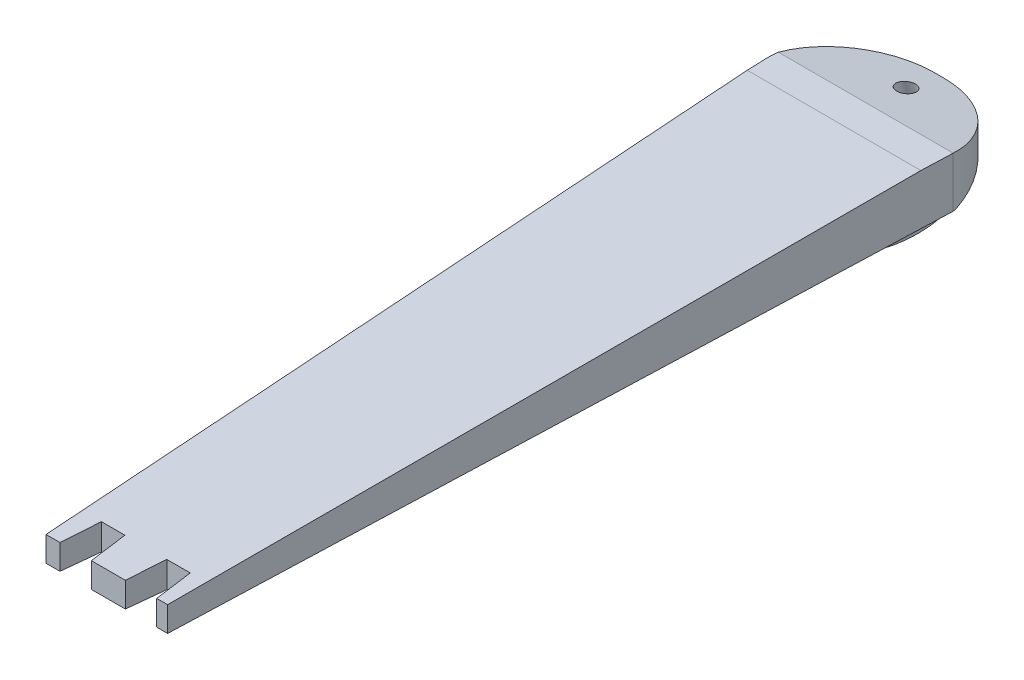
ISO-10303-21;
HEADER;
FILE_DESCRIPTION(('STEP AP214'),'2;1');
FILE_NAME('part.step','',(''),(''),'','','');
FILE_SCHEMA(('AUTOMOTIVE_DESIGN { 1 0 10303 214 1 1 1 1 }'));
ENDSEC;
DATA;
#1=APPLICATION_CONTEXT('core data for automotive mechanical design processes');
#2=APPLICATION_PROTOCOL_DEFINITION('international standard','automotive_design',2000,#1);
#3=PRODUCT_CONTEXT('',#1,'mechanical');
#4=PRODUCT('Part','Part','',(#3));
#5=PRODUCT_RELATED_PRODUCT_CATEGORY('part','',(#4));
#6=PRODUCT_DEFINITION_FORMATION('','',#4);
#7=PRODUCT_DEFINITION_CONTEXT('part definition',#1,'design');
#8=PRODUCT_DEFINITION('design','',#6,#7);
#9=PRODUCT_DEFINITION_SHAPE('','',#8);
#10=(LENGTH_UNIT() NAMED_UNIT(*) SI_UNIT(.MILLI.,.METRE.));
#11=(NAMED_UNIT(*) PLANE_ANGLE_UNIT() SI_UNIT($,.RADIAN.));
#12=(NAMED_UNIT(*) SI_UNIT($,.STERADIAN.) SOLID_ANGLE_UNIT());
#13=UNCERTAINTY_MEASURE_WITH_UNIT(LENGTH_MEASURE(1.E-05),#10,'distance_accuracy_value','');
#14=(GEOMETRIC_REPRESENTATION_CONTEXT(3) GLOBAL_UNCERTAINTY_ASSIGNED_CONTEXT((#13)) GLOBAL_UNIT_ASSIGNED_CONTEXT((#10,
#11,#12)) REPRESENTATION_CONTEXT('',''));
#15=CARTESIAN_POINT('',(0.,0.,0.));
#16=DIRECTION('',(0.,0.,1.));
#17=DIRECTION('',(1.,0.,0.));
#18=AXIS2_PLACEMENT_3D('',#15,#16,#17);
#19=CARTESIAN_POINT('',(-0.862818072965401,-4.,-19.126249045664));
#20=DIRECTION('',(0.,1.,0.));
#21=DIRECTION('',(0.,0.,1.));
#22=AXIS2_PLACEMENT_3D('',#19,#20,#21);
#23=CYLINDRICAL_SURFACE('',#22,10.);
#24=CARTESIAN_POINT('',(-0.862818072965401,-0.3627160121367,-19.126249045664));
#25=DIRECTION('',(0.,0.974370064785237,0.224951054343859));
#26=DIRECTION('',(0.,0.224951054343859,-0.974370064785237));
#27=AXIS2_PLACEMENT_3D('',#24,#25,#26);
#28=ELLIPSE('',#27,10.2630410779339,10.);
#29=CARTESIAN_POINT('',(-10.7386298593639,0.,-20.6973447014507));
#30=VERTEX_POINT('',#29);
#31=CARTESIAN_POINT('',(-7.94550184990103,-1.99251447764532,-12.0668163123678));
#32=VERTEX_POINT('',#31);
#33=EDGE_CURVE('E61',#30,#32,#28,.T.);
#34=ORIENTED_EDGE('',*,*,#33,.T.);
#35=CARTESIAN_POINT('',(-0.862818072965401,-1.98643727673337,-19.126249045664));
#36=DIRECTION('',(0.,0.999999629458084,0.000860862181097529));
#37=DIRECTION('',(0.,0.000860862181097529,-0.999999629458084));
#38=AXIS2_PLACEMENT_3D('',#35,#36,#37);
#39=ELLIPSE('',#38,10.0000037054205,10.);
#40=CARTESIAN_POINT('',(-7.93388588483091,-1.99252449384815,-12.0551812337985));
#41=VERTEX_POINT('',#40);
#42=EDGE_CURVE('E11',#32,#41,#39,.T.);
#43=ORIENTED_EDGE('',*,*,#42,.T.);
#44=DIRECTION('',(0.,1.,0.));
#45=VECTOR('',#44,1.);
#46=CARTESIAN_POINT('',(-7.93388588483091,-4.,-12.0551812337985));
#47=LINE('',#46,#45);
#48=CARTESIAN_POINT('',(-7.93388588483091,0.,-12.0551812337985));
#49=VERTEX_POINT('',#48);
#50=EDGE_CURVE('E623',#41,#49,#47,.T.);
#51=ORIENTED_EDGE('',*,*,#50,.T.);
#52=CARTESIAN_POINT('',(-0.862818072965401,0.,-19.126249045664));
#53=DIRECTION('',(0.,-1.,0.));
#54=DIRECTION('',(0.,0.,-1.));
#55=AXIS2_PLACEMENT_3D('',#52,#53,#54);
#56=CIRCLE('',#55,10.);
#57=EDGE_CURVE('E302',#49,#30,#56,.T.);
#58=ORIENTED_EDGE('',*,*,#57,.T.);
#59=EDGE_LOOP('',(#34,#43,#51,#58));
#60=FACE_BOUND('',#59,.T.);
#61=ADVANCED_FACE('F51',(#60),#23,.T.);
#62=CARTESIAN_POINT('',(0.,0.,0.));
#63=DIRECTION('',(0.,1.,0.));
#64=DIRECTION('',(0.,0.,1.));
#65=AXIS2_PLACEMENT_3D('',#62,#63,#64);
#66=PLANE('',#65);
#67=CARTESIAN_POINT('',(-1.3628180729654,0.,-19.126249045664));
#68=DIRECTION('',(0.,1.,0.));
#69=DIRECTION('',(0.,0.,1.));
#70=AXIS2_PLACEMENT_3D('',#67,#68,#69);
#71=CIRCLE('',#70,10.);
#72=CARTESIAN_POINT('',(-11.3628180729654,0.,-19.126249045664));
#73=VERTEX_POINT('',#72);
#74=CARTESIAN_POINT('',(-11.2386298593639,0.,-20.6973447014507));
#75=VERTEX_POINT('',#74);
#76=EDGE_CURVE('E319',#73,#75,#71,.F.);
#77=ORIENTED_EDGE('',*,*,#76,.T.);
#78=DIRECTION('',(1.,0.,0.));
#79=VECTOR('',#78,1.);
#80=CARTESIAN_POINT('',(0.,0.,-20.6973447014507));
#81=LINE('',#80,#79);
#82=EDGE_CURVE('E211',#75,#30,#81,.T.);
#83=ORIENTED_EDGE('',*,*,#82,.T.);
#84=ORIENTED_EDGE('',*,*,#57,.F.);
#85=DIRECTION('',(0.,0.,-1.));
#86=VECTOR('',#85,1.);
#87=CARTESIAN_POINT('',(-7.93388588483091,0.,-12.0551812337985));
#88=LINE('',#87,#86);
#89=CARTESIAN_POINT('',(-7.93388588483091,0.,-3.37144120431354));
#90=VERTEX_POINT('',#89);
#91=EDGE_CURVE('E633',#90,#49,#88,.T.);
#92=ORIENTED_EDGE('',*,*,#91,.F.);
#93=DIRECTION('',(-1.,0.,0.));
#94=VECTOR('',#93,1.);
#95=CARTESIAN_POINT('',(-7.93388588483091,0.,-3.37144120431354));
#96=LINE('',#95,#94);
#97=CARTESIAN_POINT('',(6.20824973890004,0.,-3.37144120431354));
#98=VERTEX_POINT('',#97);
#99=EDGE_CURVE('E579',#98,#90,#96,.T.);
#100=ORIENTED_EDGE('',*,*,#99,.F.);
#101=DIRECTION('',(0.,0.,1.));
#102=VECTOR('',#101,1.);
#103=CARTESIAN_POINT('',(6.20824973890004,0.,-3.37144120431354));
#104=LINE('',#103,#102);
#105=CARTESIAN_POINT('',(6.20824973890003,0.,-12.0551812337984));
#106=VERTEX_POINT('',#105);
#107=EDGE_CURVE('E577',#106,#98,#104,.T.);
#108=ORIENTED_EDGE('',*,*,#107,.F.);
#109=CARTESIAN_POINT('',(9.01299371343313,0.,-20.6973447014507));
#110=VERTEX_POINT('',#109);
#111=EDGE_CURVE('E291',#110,#106,#56,.T.);
#112=ORIENTED_EDGE('',*,*,#111,.F.);
#113=CARTESIAN_POINT('',(9.51299371343312,0.,-20.6973447014507));
#114=VERTEX_POINT('',#113);
#115=EDGE_CURVE('E68',#110,#114,#81,.T.);
#116=ORIENTED_EDGE('',*,*,#115,.T.);
#117=CARTESIAN_POINT('',(-0.362818072965401,0.,-19.126249045664));
#118=DIRECTION('',(0.,1.,0.));
#119=DIRECTION('',(0.,0.,1.));
#120=AXIS2_PLACEMENT_3D('',#117,#118,#119);
#121=CIRCLE('',#120,10.);
#122=CARTESIAN_POINT('',(9.5571677055977,0.,-20.3887395023034));
#123=VERTEX_POINT('',#122);
#124=EDGE_CURVE('E248',#114,#123,#121,.F.);
#125=ORIENTED_EDGE('',*,*,#124,.T.);
#126=DIRECTION('',(-0.0357716163253531,0.,0.999359990926929));
#127=VECTOR('',#126,1.);
#128=CARTESIAN_POINT('',(8.81606688844584,0.,0.31556692792917));
#129=LINE('',#128,#127);
#130=CARTESIAN_POINT('',(6.32174569654801,0.,70.));
#131=VERTEX_POINT('',#130);
#132=EDGE_CURVE('E429',#123,#131,#129,.T.);
#133=ORIENTED_EDGE('',*,*,#132,.T.);
#134=DIRECTION('',(1.,0.,0.));
#135=VECTOR('',#134,1.);
#136=CARTESIAN_POINT('',(0.,0.,70.));
#137=LINE('',#136,#135);
#138=CARTESIAN_POINT('',(5.02174569654801,0.,70.));
#139=VERTEX_POINT('',#138);
#140=EDGE_CURVE('E470',#139,#131,#137,.T.);
#141=ORIENTED_EDGE('',*,*,#140,.F.);
#142=DIRECTION('',(0.10452846326765,0.,0.994521895368274));
#143=VECTOR('',#142,1.);
#144=CARTESIAN_POINT('',(-2.31003207806046,0.,0.242794155003719));
#145=LINE('',#144,#143);
#146=CARTESIAN_POINT('',(4.55228543562171,0.,65.5333839807725));
#147=VERTEX_POINT('',#146);
#148=EDGE_CURVE('E466',#147,#139,#145,.T.);
#149=ORIENTED_EDGE('',*,*,#148,.F.);
#150=DIRECTION('',(1.,0.,0.));
#151=VECTOR('',#150,1.);
#152=CARTESIAN_POINT('',(0.,0.,65.5333839807725));
#153=LINE('',#152,#151);
#154=CARTESIAN_POINT('',(1.7522854356217,0.,65.5333839807726));
#155=VERTEX_POINT('',#154);
#156=EDGE_CURVE('E462',#155,#147,#153,.T.);
#157=ORIENTED_EDGE('',*,*,#156,.F.);
#158=DIRECTION('',(0.10452846326765,0.,-0.994521895368274));
#159=VECTOR('',#158,1.);
#160=CARTESIAN_POINT('',(8.54571794936367,0.,0.898191149864007));
#161=LINE('',#160,#159);
#162=CARTESIAN_POINT('',(1.2828251746954,0.,70.));
#163=VERTEX_POINT('',#162);
#164=EDGE_CURVE('E458',#163,#155,#161,.T.);
#165=ORIENTED_EDGE('',*,*,#164,.F.);
#166=DIRECTION('',(1.,0.,0.));
#167=VECTOR('',#166,1.);
#168=CARTESIAN_POINT('',(0.,0.,70.));
#169=LINE('',#168,#167);
#170=CARTESIAN_POINT('',(-2.76894294247578,0.,70.));
#171=VERTEX_POINT('',#170);
#172=EDGE_CURVE('E454',#171,#163,#169,.T.);
#173=ORIENTED_EDGE('',*,*,#172,.F.);
#174=DIRECTION('',(0.10452846326765,0.,0.994521895368274));
#175=VECTOR('',#174,1.);
#176=CARTESIAN_POINT('',(-10.015598097735,0.,1.05268177879077));
#177=LINE('',#176,#175);
#178=CARTESIAN_POINT('',(-3.23840320340209,0.,65.5333839807725));
#179=VERTEX_POINT('',#178);
#180=EDGE_CURVE('E451',#179,#171,#177,.T.);
#181=ORIENTED_EDGE('',*,*,#180,.F.);
#182=DIRECTION('',(1.,0.,0.));
#183=VECTOR('',#182,1.);
#184=CARTESIAN_POINT('',(0.,0.,65.5333839807725));
#185=LINE('',#184,#183);
#186=CARTESIAN_POINT('',(-6.03840320340209,0.,65.5333839807725));
#187=VERTEX_POINT('',#186);
#188=EDGE_CURVE('E447',#187,#179,#185,.T.);
#189=ORIENTED_EDGE('',*,*,#188,.F.);
#190=DIRECTION('',(0.104528463267651,0.,-0.994521895368274));
#191=VECTOR('',#190,1.);
#192=CARTESIAN_POINT('',(0.840151929689168,0.,0.0883035260769598));
#193=LINE('',#192,#191);
#194=CARTESIAN_POINT('',(-6.50786346432839,0.,70.));
#195=VERTEX_POINT('',#194);
#196=EDGE_CURVE('E443',#195,#187,#193,.T.);
#197=ORIENTED_EDGE('',*,*,#196,.F.);
#198=DIRECTION('',(1.,0.,0.));
#199=VECTOR('',#198,1.);
#200=CARTESIAN_POINT('',(0.,0.,70.));
#201=LINE('',#200,#199);
#202=CARTESIAN_POINT('',(-8.17258631031337,0.,70.));
#203=VERTEX_POINT('',#202);
#204=EDGE_CURVE('E440',#203,#195,#201,.T.);
#205=ORIENTED_EDGE('',*,*,#204,.F.);
#206=DIRECTION('',(0.0357716163253461,0.,0.999359990926929));
#207=VECTOR('',#206,1.);
#208=CARTESIAN_POINT('',(-10.6645391507653,0.,0.381732114804766));
#209=LINE('',#208,#207);
#210=EDGE_CURVE('E436',#73,#203,#209,.T.);
#211=ORIENTED_EDGE('',*,*,#210,.F.);
#212=EDGE_LOOP('',(#77,#83,#84,#92,#100,#108,#112,#116,#125,#133,#141,#149,#157,#165,#173,#181,
#189,#197,#205,#211));
#213=FACE_BOUND('',#212,.T.);
#214=ADVANCED_FACE('F315',(#213),#66,.F.);
#215=CARTESIAN_POINT('',(-1.3628180729654,6.,-19.126249045664));
#216=DIRECTION('',(0.,-1.,0.));
#217=DIRECTION('',(0.,0.,-1.));
#218=AXIS2_PLACEMENT_3D('',#215,#216,#217);
#219=CYLINDRICAL_SURFACE('',#218,10.);
#220=CARTESIAN_POINT('',(-1.3628180729654,-0.3627160121367,-19.126249045664));
#221=DIRECTION('',(0.,0.974370064785237,0.224951054343859));
#222=DIRECTION('',(0.,-0.224951054343859,0.974370064785237));
#223=AXIS2_PLACEMENT_3D('',#220,#221,#222);
#224=ELLIPSE('',#223,10.2630410779339,10.);
#225=CARTESIAN_POINT('',(-1.3628180729654,1.94596589911886,-29.1262490456639));
#226=VERTEX_POINT('',#225);
#227=EDGE_CURVE('E205',#75,#226,#224,.F.);
#228=ORIENTED_EDGE('',*,*,#227,.F.);
#229=ORIENTED_EDGE('',*,*,#76,.F.);
#230=DIRECTION('',(0.,-1.,0.));
#231=VECTOR('',#230,1.);
#232=CARTESIAN_POINT('',(-11.3628180729654,6.,-19.126249045664));
#233=LINE('',#232,#231);
#234=CARTESIAN_POINT('',(-11.3628180729654,6.,-19.126249045664));
#235=VERTEX_POINT('',#234);
#236=EDGE_CURVE('E283',#235,#73,#233,.T.);
#237=ORIENTED_EDGE('',*,*,#236,.F.);
#238=CARTESIAN_POINT('',(-1.3628180729654,6.,-19.126249045664));
#239=DIRECTION('',(0.,1.,0.));
#240=DIRECTION('',(0.,0.,1.));
#241=AXIS2_PLACEMENT_3D('',#238,#239,#240);
#242=CIRCLE('',#241,10.);
#243=CARTESIAN_POINT('',(-11.2828038515285,6.,-20.3887395023034));
#244=VERTEX_POINT('',#243);
#245=EDGE_CURVE('E419',#235,#244,#242,.F.);
#246=ORIENTED_EDGE('',*,*,#245,.T.);
#247=CARTESIAN_POINT('',(-1.3628180729654,6.22261113039249,-19.126249045664));
#248=DIRECTION('',(0.,-0.984807753012208,0.173648177666931));
#249=DIRECTION('',(0.,-0.173648177666931,-0.984807753012208));
#250=AXIS2_PLACEMENT_3D('',#247,#248,#249);
#251=ELLIPSE('',#250,10.1542661188575,10.);
#252=CARTESIAN_POINT('',(-1.3628180729654,4.45934132330784,-29.1262490456639));
#253=VERTEX_POINT('',#252);
#254=EDGE_CURVE('E233',#253,#244,#251,.F.);
#255=ORIENTED_EDGE('',*,*,#254,.F.);
#256=DIRECTION('',(0.,-1.,0.));
#257=VECTOR('',#256,1.);
#258=CARTESIAN_POINT('',(-1.3628180729654,6.,-29.126249045664));
#259=LINE('',#258,#257);
#260=EDGE_CURVE('E224',#253,#226,#259,.T.);
#261=ORIENTED_EDGE('',*,*,#260,.T.);
#262=EDGE_LOOP('',(#228,#229,#237,#246,#255,#261));
#263=FACE_BOUND('',#262,.T.);
#264=ADVANCED_FACE('F53',(#263),#219,.T.);
#265=CARTESIAN_POINT('',(-10.6645391507653,6.,0.381732114804766));
#266=DIRECTION('',(0.999359990926929,0.,-0.0357716163253461));
#267=DIRECTION('',(-0.0357716163253461,0.,-0.999359990926929));
#268=AXIS2_PLACEMENT_3D('',#265,#266,#267);
#269=PLANE('',#268);
#270=DIRECTION('',(0.,-1.,0.));
#271=VECTOR('',#270,1.);
#272=CARTESIAN_POINT('',(-8.17258631031337,6.,70.));
#273=LINE('',#272,#271);
#274=CARTESIAN_POINT('',(-8.17258631031337,2.97328803354314,70.));
#275=VERTEX_POINT('',#274);
#276=EDGE_CURVE('E280',#275,#203,#273,.T.);
#277=ORIENTED_EDGE('',*,*,#276,.F.);
#278=DIRECTION('',(-0.0357498530818361,0.0348771878865595,-0.998751986115549));
#279=VECTOR('',#278,1.);
#280=CARTESIAN_POINT('',(-10.6652817628497,5.40513600346535,0.360985587749771));
#281=LINE('',#280,#279);
#282=CARTESIAN_POINT('',(-11.2750299039256,6.,-16.6736904859071));
#283=VERTEX_POINT('',#282);
#284=EDGE_CURVE('E431',#275,#283,#281,.T.);
#285=ORIENTED_EDGE('',*,*,#284,.T.);
#286=DIRECTION('',(0.0357716163253461,0.,0.999359990926929));
#287=VECTOR('',#286,1.);
#288=CARTESIAN_POINT('',(-10.6645391507653,6.,0.381732114804766));
#289=LINE('',#288,#287);
#290=EDGE_CURVE('E245',#235,#283,#289,.T.);
#291=ORIENTED_EDGE('',*,*,#290,.F.);
#292=ORIENTED_EDGE('',*,*,#236,.T.);
#293=ORIENTED_EDGE('',*,*,#210,.T.);
#294=EDGE_LOOP('',(#277,#285,#291,#292,#293));
#295=FACE_BOUND('',#294,.T.);
#296=ADVANCED_FACE('F535',(#295),#269,.F.);
#297=CARTESIAN_POINT('',(0.,6.,70.));
#298=DIRECTION('',(0.,0.,-1.));
#299=DIRECTION('',(-1.,0.,0.));
#300=AXIS2_PLACEMENT_3D('',#297,#298,#299);
#301=PLANE('',#300);
#302=DIRECTION('',(0.,-1.,0.));
#303=VECTOR('',#302,1.);
#304=CARTESIAN_POINT('',(-6.50786346432839,6.,70.));
#305=LINE('',#304,#303);
#306=CARTESIAN_POINT('',(-6.5078634643284,2.97328803354314,70.));
#307=VERTEX_POINT('',#306);
#308=EDGE_CURVE('E277',#307,#195,#305,.T.);
#309=ORIENTED_EDGE('',*,*,#308,.F.);
#310=DIRECTION('',(1.,0.,0.));
#311=VECTOR('',#310,1.);
#312=CARTESIAN_POINT('',(-11.3628180729654,2.97328803354314,70.));
#313=LINE('',#312,#311);
#314=EDGE_CURVE('E532',#275,#307,#313,.T.);
#315=ORIENTED_EDGE('',*,*,#314,.F.);
#316=ORIENTED_EDGE('',*,*,#276,.T.);
#317=ORIENTED_EDGE('',*,*,#204,.T.);
#318=EDGE_LOOP('',(#309,#315,#316,#317));
#319=FACE_BOUND('',#318,.T.);
#320=ADVANCED_FACE('F529',(#319),#301,.F.);
#321=CARTESIAN_POINT('',(0.840151929689168,6.,0.0883035260769598));
#322=DIRECTION('',(-0.994521895368274,0.,-0.104528463267651));
#323=DIRECTION('',(-0.104528463267651,0.,0.994521895368274));
#324=AXIS2_PLACEMENT_3D('',#321,#322,#323);
#325=PLANE('',#324);
#326=DIRECTION('',(0.,-1.,0.));
#327=VECTOR('',#326,1.);
#328=CARTESIAN_POINT('',(-6.03840320340209,6.,65.5333839807725));
#329=LINE('',#328,#327);
#330=CARTESIAN_POINT('',(-6.03840320340209,3.1292657019587,65.5333839807725));
#331=VERTEX_POINT('',#330);
#332=EDGE_CURVE('E274',#331,#187,#329,.T.);
#333=ORIENTED_EDGE('',*,*,#332,.F.);
#334=DIRECTION('',(-0.104465482459189,-0.0347085445565511,0.993922673002953));
#335=VECTOR('',#334,1.);
#336=CARTESIAN_POINT('',(0.842274287984664,5.415363422154,0.0681106357511674));
#337=LINE('',#336,#335);
#338=EDGE_CURVE('E554',#331,#307,#337,.T.);
#339=ORIENTED_EDGE('',*,*,#338,.T.);
#340=ORIENTED_EDGE('',*,*,#308,.T.);
#341=ORIENTED_EDGE('',*,*,#196,.T.);
#342=EDGE_LOOP('',(#333,#339,#340,#341));
#343=FACE_BOUND('',#342,.T.);
#344=ADVANCED_FACE('F525',(#343),#325,.F.);
#345=CARTESIAN_POINT('',(0.,6.,65.5333839807725));
#346=DIRECTION('',(0.,0.,-1.));
#347=DIRECTION('',(-1.,0.,0.));
#348=AXIS2_PLACEMENT_3D('',#345,#346,#347);
#349=PLANE('',#348);
#350=DIRECTION('',(0.,-1.,0.));
#351=VECTOR('',#350,1.);
#352=CARTESIAN_POINT('',(-3.23840320340209,6.,65.5333839807725));
#353=LINE('',#352,#351);
#354=CARTESIAN_POINT('',(-3.23840320340208,3.1292657019587,65.5333839807725));
#355=VERTEX_POINT('',#354);
#356=EDGE_CURVE('E271',#355,#179,#353,.T.);
#357=ORIENTED_EDGE('',*,*,#356,.F.);
#358=DIRECTION('',(-1.,0.,0.));
#359=VECTOR('',#358,1.);
#360=CARTESIAN_POINT('',(0.,3.1292657019587,65.5333839807725));
#361=LINE('',#360,#359);
#362=EDGE_CURVE('E522',#355,#331,#361,.T.);
#363=ORIENTED_EDGE('',*,*,#362,.T.);
#364=ORIENTED_EDGE('',*,*,#332,.T.);
#365=ORIENTED_EDGE('',*,*,#188,.T.);
#366=EDGE_LOOP('',(#357,#363,#364,#365));
#367=FACE_BOUND('',#366,.T.);
#368=ADVANCED_FACE('F520',(#367),#349,.F.);
#369=CARTESIAN_POINT('',(-10.015598097735,6.,1.05268177879077));
#370=DIRECTION('',(0.994521895368274,0.,-0.10452846326765));
#371=DIRECTION('',(-0.10452846326765,0.,-0.994521895368274));
#372=AXIS2_PLACEMENT_3D('',#369,#370,#371);
#373=PLANE('',#372);
#374=DIRECTION('',(0.,-1.,0.));
#375=VECTOR('',#374,1.);
#376=CARTESIAN_POINT('',(-2.76894294247578,6.,70.));
#377=LINE('',#376,#375);
#378=CARTESIAN_POINT('',(-2.76894294247578,2.97328803354314,70.));
#379=VERTEX_POINT('',#378);
#380=EDGE_CURVE('E268',#379,#171,#377,.T.);
#381=ORIENTED_EDGE('',*,*,#380,.F.);
#382=DIRECTION('',(-0.104465482459189,0.0347085445565511,-0.993922673002953));
#383=VECTOR('',#382,1.);
#384=CARTESIAN_POINT('',(-10.0178425629936,5.38172716139573,1.03132711831545));
#385=LINE('',#384,#383);
#386=EDGE_CURVE('E517',#379,#355,#385,.T.);
#387=ORIENTED_EDGE('',*,*,#386,.T.);
#388=ORIENTED_EDGE('',*,*,#356,.T.);
#389=ORIENTED_EDGE('',*,*,#180,.T.);
#390=EDGE_LOOP('',(#381,#387,#388,#389));
#391=FACE_BOUND('',#390,.T.);
#392=ADVANCED_FACE('F514',(#391),#373,.F.);
#393=CARTESIAN_POINT('',(0.,6.,70.));
#394=DIRECTION('',(0.,0.,-1.));
#395=DIRECTION('',(-1.,0.,0.));
#396=AXIS2_PLACEMENT_3D('',#393,#394,#395);
#397=PLANE('',#396);
#398=DIRECTION('',(0.,-1.,0.));
#399=VECTOR('',#398,1.);
#400=CARTESIAN_POINT('',(1.2828251746954,6.,70.));
#401=LINE('',#400,#399);
#402=CARTESIAN_POINT('',(1.28282517469539,2.97328803354314,70.));
#403=VERTEX_POINT('',#402);
#404=EDGE_CURVE('E265',#403,#163,#401,.T.);
#405=ORIENTED_EDGE('',*,*,#404,.F.);
#406=EDGE_CURVE('E545',#379,#403,#313,.T.);
#407=ORIENTED_EDGE('',*,*,#406,.F.);
#408=ORIENTED_EDGE('',*,*,#380,.T.);
#409=ORIENTED_EDGE('',*,*,#172,.T.);
#410=EDGE_LOOP('',(#405,#407,#408,#409));
#411=FACE_BOUND('',#410,.T.);
#412=ADVANCED_FACE('F508',(#411),#397,.F.);
#413=CARTESIAN_POINT('',(8.54571794936367,6.,0.898191149864007));
#414=DIRECTION('',(-0.994521895368274,0.,-0.10452846326765));
#415=DIRECTION('',(-0.10452846326765,0.,0.994521895368274));
#416=AXIS2_PLACEMENT_3D('',#413,#414,#415);
#417=PLANE('',#416);
#418=DIRECTION('',(0.,-1.,0.));
#419=VECTOR('',#418,1.);
#420=CARTESIAN_POINT('',(1.7522854356217,6.,65.5333839807726));
#421=LINE('',#420,#419);
#422=CARTESIAN_POINT('',(1.7522854356217,3.1292657019587,65.5333839807725));
#423=VERTEX_POINT('',#422);
#424=EDGE_CURVE('E262',#423,#155,#421,.T.);
#425=ORIENTED_EDGE('',*,*,#424,.F.);
#426=DIRECTION('',(-0.104465482459189,-0.0347085445565511,0.993922673002953));
#427=VECTOR('',#426,1.);
#428=CARTESIAN_POINT('',(8.54794285343717,5.38711559385433,0.877022601633095));
#429=LINE('',#428,#427);
#430=EDGE_CURVE('E505',#423,#403,#429,.T.);
#431=ORIENTED_EDGE('',*,*,#430,.T.);
#432=ORIENTED_EDGE('',*,*,#404,.T.);
#433=ORIENTED_EDGE('',*,*,#164,.T.);
#434=EDGE_LOOP('',(#425,#431,#432,#433));
#435=FACE_BOUND('',#434,.T.);
#436=ADVANCED_FACE('F503',(#435),#417,.F.);
#437=CARTESIAN_POINT('',(0.,6.,65.5333839807725));
#438=DIRECTION('',(0.,0.,-1.));
#439=DIRECTION('',(-1.,0.,0.));
#440=AXIS2_PLACEMENT_3D('',#437,#438,#439);
#441=PLANE('',#440);
#442=DIRECTION('',(0.,-1.,0.));
#443=VECTOR('',#442,1.);
#444=CARTESIAN_POINT('',(4.55228543562171,6.,65.5333839807725));
#445=LINE('',#444,#443);
#446=CARTESIAN_POINT('',(4.55228543562171,3.1292657019587,65.5333839807725));
#447=VERTEX_POINT('',#446);
#448=EDGE_CURVE('E259',#447,#147,#445,.T.);
#449=ORIENTED_EDGE('',*,*,#448,.F.);
#450=DIRECTION('',(-1.,0.,0.));
#451=VECTOR('',#450,1.);
#452=CARTESIAN_POINT('',(0.,3.1292657019587,65.5333839807725));
#453=LINE('',#452,#451);
#454=EDGE_CURVE('E500',#447,#423,#453,.T.);
#455=ORIENTED_EDGE('',*,*,#454,.T.);
#456=ORIENTED_EDGE('',*,*,#424,.T.);
#457=ORIENTED_EDGE('',*,*,#156,.T.);
#458=EDGE_LOOP('',(#449,#455,#456,#457));
#459=FACE_BOUND('',#458,.T.);
#460=ADVANCED_FACE('F497',(#459),#441,.F.);
#461=CARTESIAN_POINT('',(-2.31003207806046,6.,0.242794155003719));
#462=DIRECTION('',(0.994521895368274,0.,-0.10452846326765));
#463=DIRECTION('',(-0.10452846326765,0.,-0.994521895368274));
#464=AXIS2_PLACEMENT_3D('',#461,#462,#463);
#465=PLANE('',#464);
#466=DIRECTION('',(0.,-1.,0.));
#467=VECTOR('',#466,1.);
#468=CARTESIAN_POINT('',(5.02174569654801,6.,70.));
#469=LINE('',#468,#467);
#470=CARTESIAN_POINT('',(5.02174569654801,2.97328803354314,70.));
#471=VERTEX_POINT('',#470);
#472=EDGE_CURVE('E257',#471,#139,#469,.T.);
#473=ORIENTED_EDGE('',*,*,#472,.F.);
#474=DIRECTION('',(-0.104465482459189,0.0347085445565511,-0.993922673002953));
#475=VECTOR('',#474,1.);
#476=CARTESIAN_POINT('',(-2.31217399754108,5.4099749896954,0.222415152433521));
#477=LINE('',#476,#475);
#478=EDGE_CURVE('E538',#471,#447,#477,.T.);
#479=ORIENTED_EDGE('',*,*,#478,.T.);
#480=ORIENTED_EDGE('',*,*,#448,.T.);
#481=ORIENTED_EDGE('',*,*,#148,.T.);
#482=EDGE_LOOP('',(#473,#479,#480,#481));
#483=FACE_BOUND('',#482,.T.);
#484=ADVANCED_FACE('F491',(#483),#465,.F.);
#485=CARTESIAN_POINT('',(0.,6.,70.));
#486=DIRECTION('',(0.,0.,-1.));
#487=DIRECTION('',(-1.,0.,0.));
#488=AXIS2_PLACEMENT_3D('',#485,#486,#487);
#489=PLANE('',#488);
#490=DIRECTION('',(0.,-1.,0.));
#491=VECTOR('',#490,1.);
#492=CARTESIAN_POINT('',(6.32174569654801,6.,70.));
#493=LINE('',#492,#491);
#494=CARTESIAN_POINT('',(6.32174569654801,2.97328803354314,70.));
#495=VERTEX_POINT('',#494);
#496=EDGE_CURVE('E254',#495,#131,#493,.T.);
#497=ORIENTED_EDGE('',*,*,#496,.F.);
#498=EDGE_CURVE('E411',#471,#495,#313,.T.);
#499=ORIENTED_EDGE('',*,*,#498,.F.);
#500=ORIENTED_EDGE('',*,*,#472,.T.);
#501=ORIENTED_EDGE('',*,*,#140,.T.);
#502=EDGE_LOOP('',(#497,#499,#500,#501));
#503=FACE_BOUND('',#502,.T.);
#504=ADVANCED_FACE('F487',(#503),#489,.F.);
#505=CARTESIAN_POINT('',(8.81606688844584,6.,0.31556692792917));
#506=DIRECTION('',(0.999359990926929,0.,0.0357716163253531));
#507=DIRECTION('',(0.0357716163253531,0.,-0.999359990926929));
#508=AXIS2_PLACEMENT_3D('',#505,#506,#507);
#509=PLANE('',#508);
#510=DIRECTION('',(0.0357498530818431,0.0348771878865595,-0.998751986115548));
#511=VECTOR('',#510,1.);
#512=CARTESIAN_POINT('',(8.81680661962432,5.40744373212255,0.294900885414005));
#513=LINE('',#512,#511);
#514=CARTESIAN_POINT('',(9.42418929016089,6.,-16.6736904859071));
#515=VERTEX_POINT('',#514);
#516=EDGE_CURVE('E484',#495,#515,#513,.T.);
#517=ORIENTED_EDGE('',*,*,#516,.F.);
#518=ORIENTED_EDGE('',*,*,#496,.T.);
#519=ORIENTED_EDGE('',*,*,#132,.F.);
#520=DIRECTION('',(0.,-1.,0.));
#521=VECTOR('',#520,1.);
#522=CARTESIAN_POINT('',(9.5571677055977,6.,-20.3887395023034));
#523=LINE('',#522,#521);
#524=CARTESIAN_POINT('',(9.5571677055977,6.,-20.3887395023034));
#525=VERTEX_POINT('',#524);
#526=EDGE_CURVE('E241',#525,#123,#523,.T.);
#527=ORIENTED_EDGE('',*,*,#526,.F.);
#528=DIRECTION('',(-0.0357716163253531,0.,0.999359990926929));
#529=VECTOR('',#528,1.);
#530=CARTESIAN_POINT('',(8.81606688844584,6.,0.31556692792917));
#531=LINE('',#530,#529);
#532=EDGE_CURVE('E235',#525,#515,#531,.T.);
#533=ORIENTED_EDGE('',*,*,#532,.T.);
#534=EDGE_LOOP('',(#517,#518,#519,#527,#533));
#535=FACE_BOUND('',#534,.T.);
#536=ADVANCED_FACE('F482',(#535),#509,.T.);
#537=CARTESIAN_POINT('',(-0.362818072965401,6.,-19.126249045664));
#538=DIRECTION('',(0.,-1.,0.));
#539=DIRECTION('',(0.,0.,-1.));
#540=AXIS2_PLACEMENT_3D('',#537,#538,#539);
#541=CYLINDRICAL_SURFACE('',#540,10.);
#542=CARTESIAN_POINT('',(-0.362818072965401,-0.3627160121367,-19.126249045664));
#543=DIRECTION('',(0.,0.974370064785237,0.224951054343859));
#544=DIRECTION('',(0.,-0.224951054343859,0.974370064785237));
#545=AXIS2_PLACEMENT_3D('',#542,#543,#544);
#546=ELLIPSE('',#545,10.2630410779339,10.);
#547=CARTESIAN_POINT('',(-0.3628180729654,1.94596589911886,-29.1262490456639));
#548=VERTEX_POINT('',#547);
#549=EDGE_CURVE('E321',#548,#114,#546,.F.);
#550=ORIENTED_EDGE('',*,*,#549,.F.);
#551=DIRECTION('',(0.,-1.,0.));
#552=VECTOR('',#551,1.);
#553=CARTESIAN_POINT('',(-0.362818072965401,6.,-29.1262490456639));
#554=LINE('',#553,#552);
#555=CARTESIAN_POINT('',(-0.3628180729654,4.45934132330784,-29.1262490456639));
#556=VERTEX_POINT('',#555);
#557=EDGE_CURVE('E226',#556,#548,#554,.T.);
#558=ORIENTED_EDGE('',*,*,#557,.F.);
#559=CARTESIAN_POINT('',(-0.362818072965401,6.22261113039249,-19.126249045664));
#560=DIRECTION('',(0.,-0.984807753012208,0.173648177666931));
#561=DIRECTION('',(0.,-0.173648177666931,-0.984807753012208));
#562=AXIS2_PLACEMENT_3D('',#559,#560,#561);
#563=ELLIPSE('',#562,10.1542661188574,10.);
#564=EDGE_CURVE('E412',#525,#556,#563,.F.);
#565=ORIENTED_EDGE('',*,*,#564,.F.);
#566=ORIENTED_EDGE('',*,*,#526,.T.);
#567=ORIENTED_EDGE('',*,*,#124,.F.);
#568=EDGE_LOOP('',(#550,#558,#565,#566,#567));
#569=FACE_BOUND('',#568,.T.);
#570=ADVANCED_FACE('F645',(#569),#541,.T.);
#571=CARTESIAN_POINT('',(2.02103951946641E-13,6.,-29.1262490456639));
#572=DIRECTION('',(0.,0.,-1.));
#573=DIRECTION('',(-1.,0.,0.));
#574=AXIS2_PLACEMENT_3D('',#571,#572,#573);
#575=PLANE('',#574);
#576=DIRECTION('',(1.,0.,0.));
#577=VECTOR('',#576,1.);
#578=CARTESIAN_POINT('',(-11.3628180729654,1.94596589911886,-29.1262490456639));
#579=LINE('',#578,#577);
#580=EDGE_CURVE('E208',#226,#548,#579,.T.);
#581=ORIENTED_EDGE('',*,*,#580,.F.);
#582=ORIENTED_EDGE('',*,*,#260,.F.);
#583=DIRECTION('',(1.,0.,0.));
#584=VECTOR('',#583,1.);
#585=CARTESIAN_POINT('',(-11.3628180729654,4.45934132330784,-29.1262490456639));
#586=LINE('',#585,#584);
#587=EDGE_CURVE('E409',#253,#556,#586,.T.);
#588=ORIENTED_EDGE('',*,*,#587,.T.);
#589=ORIENTED_EDGE('',*,*,#557,.T.);
#590=EDGE_LOOP('',(#581,#582,#588,#589));
#591=FACE_BOUND('',#590,.T.);
#592=ADVANCED_FACE('F222',(#591),#575,.T.);
#593=CARTESIAN_POINT('',(0.,6.,0.));
#594=DIRECTION('',(0.,1.,0.));
#595=DIRECTION('',(0.,0.,1.));
#596=AXIS2_PLACEMENT_3D('',#593,#594,#595);
#597=PLANE('',#596);
#598=DIRECTION('',(1.,0.,0.));
#599=VECTOR('',#598,1.);
#600=CARTESIAN_POINT('',(0.,6.,-20.3887395023034));
#601=LINE('',#600,#599);
#602=EDGE_CURVE('E289',#244,#525,#601,.T.);
#603=ORIENTED_EDGE('',*,*,#602,.F.);
#604=ORIENTED_EDGE('',*,*,#245,.F.);
#605=ORIENTED_EDGE('',*,*,#290,.T.);
#606=DIRECTION('',(-1.,0.,0.));
#607=VECTOR('',#606,1.);
#608=CARTESIAN_POINT('',(0.,6.,-16.6736904859071));
#609=LINE('',#608,#607);
#610=EDGE_CURVE('E286',#515,#283,#609,.T.);
#611=ORIENTED_EDGE('',*,*,#610,.F.);
#612=ORIENTED_EDGE('',*,*,#532,.F.);
#613=EDGE_LOOP('',(#603,#604,#605,#611,#612));
#614=FACE_BOUND('',#613,.T.);
#615=ADVANCED_FACE('F417',(#614),#597,.T.);
#616=CARTESIAN_POINT('',(-11.3628180729654,2.97328803354314,70.));
#617=DIRECTION('',(0.,-0.999390827019096,-0.0348994967024942));
#618=DIRECTION('',(0.,0.0348994967024942,-0.999390827019096));
#619=AXIS2_PLACEMENT_3D('',#616,#617,#618);
#620=PLANE('',#619);
#621=ORIENTED_EDGE('',*,*,#314,.T.);
#622=ORIENTED_EDGE('',*,*,#338,.F.);
#623=ORIENTED_EDGE('',*,*,#362,.F.);
#624=ORIENTED_EDGE('',*,*,#386,.F.);
#625=ORIENTED_EDGE('',*,*,#406,.T.);
#626=ORIENTED_EDGE('',*,*,#430,.F.);
#627=ORIENTED_EDGE('',*,*,#454,.F.);
#628=ORIENTED_EDGE('',*,*,#478,.F.);
#629=ORIENTED_EDGE('',*,*,#498,.T.);
#630=ORIENTED_EDGE('',*,*,#516,.T.);
#631=ORIENTED_EDGE('',*,*,#610,.T.);
#632=ORIENTED_EDGE('',*,*,#284,.F.);
#633=EDGE_LOOP('',(#621,#622,#623,#624,#625,#626,#627,#628,#629,#630,#631,#632));
#634=FACE_BOUND('',#633,.T.);
#635=ADVANCED_FACE('F405',(#634),#620,.F.);
#636=CARTESIAN_POINT('',(-11.3628180729654,6.,-20.3887395023034));
#637=DIRECTION('',(0.,-0.984807753012208,0.173648177666931));
#638=DIRECTION('',(0.,-0.173648177666931,-0.984807753012208));
#639=AXIS2_PLACEMENT_3D('',#636,#637,#638);
#640=PLANE('',#639);
#641=CARTESIAN_POINT('',(-0.862818072965401,5.15233676753204,-25.1960765817574));
#642=DIRECTION('',(0.,-0.984807753012208,0.173648177666931));
#643=DIRECTION('',(0.,-0.173648177666931,-0.984807753012208));
#644=AXIS2_PLACEMENT_3D('',#641,#642,#643);
#645=ELLIPSE('',#644,1.14067839627556,1.05);
#646=CARTESIAN_POINT('',(-0.862818072965401,4.95426004271475,-26.3194255101031));
#647=VERTEX_POINT('',#646);
#648=EDGE_CURVE('E229',#647,#647,#645,.T.);
#649=ORIENTED_EDGE('',*,*,#648,.T.);
#650=EDGE_LOOP('',(#649));
#651=FACE_BOUND('',#650,.T.);
#652=ORIENTED_EDGE('',*,*,#254,.T.);
#653=ORIENTED_EDGE('',*,*,#602,.T.);
#654=ORIENTED_EDGE('',*,*,#564,.T.);
#655=ORIENTED_EDGE('',*,*,#587,.F.);
#656=EDGE_LOOP('',(#652,#653,#654,#655));
#657=FACE_BOUND('',#656,.T.);
#658=ADVANCED_FACE('F401',(#651,#657),#640,.F.);
#659=CARTESIAN_POINT('',(6.20824973890004,-4.,-3.37144120431354));
#660=DIRECTION('',(-1.,0.,0.));
#661=DIRECTION('',(0.,0.,1.));
#662=AXIS2_PLACEMENT_3D('',#659,#660,#661);
#663=PLANE('',#662);
#664=DIRECTION('',(0.,1.,0.));
#665=VECTOR('',#664,1.);
#666=CARTESIAN_POINT('',(6.20824973890004,-4.,-3.37144120431354));
#667=LINE('',#666,#665);
#668=CARTESIAN_POINT('',(6.20824973890004,-2.,-3.37144120431354));
#669=VERTEX_POINT('',#668);
#670=EDGE_CURVE('E640',#669,#98,#667,.T.);
#671=ORIENTED_EDGE('',*,*,#670,.F.);
#672=DIRECTION('',(0.,0.000860862181097529,-0.999999629458084));
#673=VECTOR('',#672,1.);
#674=CARTESIAN_POINT('',(6.20824973890004,-2.00000148216739,-3.36971948058932));
#675=LINE('',#674,#673);
#676=CARTESIAN_POINT('',(6.20824973890003,-1.99252449384815,-12.0551812337984));
#677=VERTEX_POINT('',#676);
#678=EDGE_CURVE('E217',#669,#677,#675,.T.);
#679=ORIENTED_EDGE('',*,*,#678,.T.);
#680=DIRECTION('',(0.,1.,0.));
#681=VECTOR('',#680,1.);
#682=CARTESIAN_POINT('',(6.20824973890003,-4.,-12.0551812337984));
#683=LINE('',#682,#681);
#684=EDGE_CURVE('E76',#677,#106,#683,.T.);
#685=ORIENTED_EDGE('',*,*,#684,.T.);
#686=ORIENTED_EDGE('',*,*,#107,.T.);
#687=EDGE_LOOP('',(#671,#679,#685,#686));
#688=FACE_BOUND('',#687,.T.);
#689=ADVANCED_FACE('F404',(#688),#663,.F.);
#690=CARTESIAN_POINT('',(-7.93388588483091,-4.,-3.37144120431354));
#691=DIRECTION('',(0.,0.,-1.));
#692=DIRECTION('',(-1.,0.,0.));
#693=AXIS2_PLACEMENT_3D('',#690,#691,#692);
#694=PLANE('',#693);
#695=DIRECTION('',(0.,1.,0.));
#696=VECTOR('',#695,1.);
#697=CARTESIAN_POINT('',(-7.93388588483091,-4.,-3.37144120431354));
#698=LINE('',#697,#696);
#699=CARTESIAN_POINT('',(-7.93388588483091,-2.,-3.37144120431354));
#700=VERTEX_POINT('',#699);
#701=EDGE_CURVE('E625',#700,#90,#698,.T.);
#702=ORIENTED_EDGE('',*,*,#701,.F.);
#703=DIRECTION('',(1.,0.,0.));
#704=VECTOR('',#703,1.);
#705=CARTESIAN_POINT('',(-11.3628180729654,-2.,-3.37144120431354));
#706=LINE('',#705,#704);
#707=EDGE_CURVE('E328',#700,#669,#706,.T.);
#708=ORIENTED_EDGE('',*,*,#707,.T.);
#709=ORIENTED_EDGE('',*,*,#670,.T.);
#710=ORIENTED_EDGE('',*,*,#99,.T.);
#711=EDGE_LOOP('',(#702,#708,#709,#710));
#712=FACE_BOUND('',#711,.T.);
#713=ADVANCED_FACE('F667',(#712),#694,.F.);
#714=CARTESIAN_POINT('',(-7.93388588483091,-4.,-12.0551812337985));
#715=DIRECTION('',(1.,0.,0.));
#716=DIRECTION('',(0.,0.,-1.));
#717=AXIS2_PLACEMENT_3D('',#714,#715,#716);
#718=PLANE('',#717);
#719=ORIENTED_EDGE('',*,*,#50,.F.);
#720=DIRECTION('',(0.,-0.000860862181097529,0.999999629458084));
#721=VECTOR('',#720,1.);
#722=CARTESIAN_POINT('',(-7.93388588483091,-1.99252598155551,-12.0534530746961));
#723=LINE('',#722,#721);
#724=EDGE_CURVE('E580',#41,#700,#723,.T.);
#725=ORIENTED_EDGE('',*,*,#724,.T.);
#726=ORIENTED_EDGE('',*,*,#701,.T.);
#727=ORIENTED_EDGE('',*,*,#91,.T.);
#728=EDGE_LOOP('',(#719,#725,#726,#727));
#729=FACE_BOUND('',#728,.T.);
#730=ADVANCED_FACE('F661',(#729),#718,.F.);
#731=ORIENTED_EDGE('',*,*,#684,.F.);
#732=CARTESIAN_POINT('',(6.21986570397022,-1.99251447764532,-12.0668163123678));
#733=VERTEX_POINT('',#732);
#734=EDGE_CURVE('E55',#677,#733,#39,.T.);
#735=ORIENTED_EDGE('',*,*,#734,.T.);
#736=EDGE_CURVE('E292',#733,#110,#28,.T.);
#737=ORIENTED_EDGE('',*,*,#736,.T.);
#738=ORIENTED_EDGE('',*,*,#111,.T.);
#739=EDGE_LOOP('',(#731,#735,#737,#738));
#740=FACE_BOUND('',#739,.T.);
#741=ADVANCED_FACE('F655',(#740),#23,.T.);
#742=CARTESIAN_POINT('',(-11.3628180729654,-1.99251447764532,-12.0668163123678));
#743=DIRECTION('',(0.,0.999999629458084,0.000860862181097529));
#744=DIRECTION('',(0.,-0.000860862181097529,0.999999629458084));
#745=AXIS2_PLACEMENT_3D('',#742,#743,#744);
#746=PLANE('',#745);
#747=ORIENTED_EDGE('',*,*,#42,.F.);
#748=DIRECTION('',(1.,0.,0.));
#749=VECTOR('',#748,1.);
#750=CARTESIAN_POINT('',(-11.3628180729654,-1.99251447764532,-12.0668163123678));
#751=LINE('',#750,#749);
#752=EDGE_CURVE('E228',#32,#733,#751,.T.);
#753=ORIENTED_EDGE('',*,*,#752,.T.);
#754=ORIENTED_EDGE('',*,*,#734,.F.);
#755=ORIENTED_EDGE('',*,*,#678,.F.);
#756=ORIENTED_EDGE('',*,*,#707,.F.);
#757=ORIENTED_EDGE('',*,*,#724,.F.);
#758=EDGE_LOOP('',(#747,#753,#754,#755,#756,#757));
#759=FACE_BOUND('',#758,.T.);
#760=ADVANCED_FACE('F387',(#759),#746,.F.);
#761=CARTESIAN_POINT('',(-11.3628180729654,-1.99251447764532,-12.0668163123678));
#762=DIRECTION('',(0.,0.974370064785237,0.224951054343859));
#763=DIRECTION('',(0.,-0.224951054343859,0.974370064785237));
#764=AXIS2_PLACEMENT_3D('',#761,#762,#763);
#765=PLANE('',#764);
#766=CARTESIAN_POINT('',(-0.862818072965401,-1.3851466309169,-14.697615487288));
#767=DIRECTION('',(0.,-0.974370064785237,-0.224951054343859));
#768=DIRECTION('',(0.,0.224951054343859,-0.974370064785237));
#769=AXIS2_PLACEMENT_3D('',#766,#767,#768);
#770=CIRCLE('',#769,1.05);
#771=CARTESIAN_POINT('',(-0.862818072965401,-1.14894802385585,-15.7207040553125));
#772=VERTEX_POINT('',#771);
#773=EDGE_CURVE('E366',#772,#772,#770,.T.);
#774=ORIENTED_EDGE('',*,*,#773,.F.);
#775=EDGE_LOOP('',(#774));
#776=FACE_BOUND('',#775,.T.);
#777=CARTESIAN_POINT('',(-0.862818072965401,-0.507837518975852,-18.4976587399504));
#778=DIRECTION('',(0.,-0.974370064785237,-0.224951054343859));
#779=DIRECTION('',(0.,0.224951054343859,-0.974370064785237));
#780=AXIS2_PLACEMENT_3D('',#777,#778,#779);
#781=CIRCLE('',#780,1.05);
#782=CARTESIAN_POINT('',(-0.862818072965401,-0.2716389119148,-19.5207473079749));
#783=VERTEX_POINT('',#782);
#784=EDGE_CURVE('E362',#783,#783,#781,.T.);
#785=ORIENTED_EDGE('',*,*,#784,.F.);
#786=EDGE_LOOP('',(#785));
#787=FACE_BOUND('',#786,.T.);
#788=CARTESIAN_POINT('',(-0.862818072965401,0.369471592965197,-22.2977019926128));
#789=DIRECTION('',(0.,-0.974370064785237,-0.224951054343859));
#790=DIRECTION('',(0.,0.224951054343859,-0.974370064785237));
#791=AXIS2_PLACEMENT_3D('',#788,#789,#790);
#792=CIRCLE('',#791,1.05);
#793=CARTESIAN_POINT('',(-0.862818072965401,0.605670200026248,-23.3207905606373));
#794=VERTEX_POINT('',#793);
#795=EDGE_CURVE('E354',#794,#794,#792,.T.);
#796=ORIENTED_EDGE('',*,*,#795,.F.);
#797=EDGE_LOOP('',(#796));
#798=FACE_BOUND('',#797,.T.);
#799=CARTESIAN_POINT('',(-0.862818072965401,1.24678070490625,-26.0977452452752));
#800=DIRECTION('',(0.,-0.974370064785237,-0.224951054343859));
#801=DIRECTION('',(0.,0.224951054343859,-0.974370064785237));
#802=AXIS2_PLACEMENT_3D('',#799,#800,#801);
#803=CIRCLE('',#802,1.05);
#804=CARTESIAN_POINT('',(-0.862818072965401,1.4829793119673,-27.1208338132997));
#805=VERTEX_POINT('',#804);
#806=EDGE_CURVE('E346',#805,#805,#803,.T.);
#807=ORIENTED_EDGE('',*,*,#806,.F.);
#808=EDGE_LOOP('',(#807));
#809=FACE_BOUND('',#808,.T.);
#810=ORIENTED_EDGE('',*,*,#227,.T.);
#811=ORIENTED_EDGE('',*,*,#580,.T.);
#812=ORIENTED_EDGE('',*,*,#549,.T.);
#813=ORIENTED_EDGE('',*,*,#115,.F.);
#814=ORIENTED_EDGE('',*,*,#736,.F.);
#815=ORIENTED_EDGE('',*,*,#752,.F.);
#816=ORIENTED_EDGE('',*,*,#33,.F.);
#817=ORIENTED_EDGE('',*,*,#82,.F.);
#818=EDGE_LOOP('',(#810,#811,#812,#813,#814,#815,#816,#817));
#819=FACE_BOUND('',#818,.T.);
#820=ADVANCED_FACE('F207',(#776,#787,#798,#809,#819),#765,.F.);
#821=CARTESIAN_POINT('',(-0.862818072965401,6.11863102883243,-24.9729899735559));
#822=DIRECTION('',(0.,-0.974370064785237,-0.224951054343859));
#823=DIRECTION('',(0.,0.224951054343859,-0.974370064785237));
#824=AXIS2_PLACEMENT_3D('',#821,#822,#823);
#825=CYLINDRICAL_SURFACE('',#824,1.05);
#826=ORIENTED_EDGE('',*,*,#806,.T.);
#827=EDGE_LOOP('',(#826));
#828=FACE_BOUND('',#827,.T.);
#829=ORIENTED_EDGE('',*,*,#648,.F.);
#830=EDGE_LOOP('',(#829));
#831=FACE_BOUND('',#830,.T.);
#832=ADVANCED_FACE('F386',(#828,#831),#825,.F.);
#833=CARTESIAN_POINT('',(-0.862818072965401,5.24132191689138,-21.1729467208935));
#834=DIRECTION('',(0.,-0.974370064785237,-0.224951054343859));
#835=DIRECTION('',(0.,0.224951054343859,-0.974370064785237));
#836=AXIS2_PLACEMENT_3D('',#833,#834,#835);
#837=CYLINDRICAL_SURFACE('',#836,1.05);
#838=CARTESIAN_POINT('',(-0.862818072965401,5.24132191689138,-21.1729467208935));
#839=DIRECTION('',(0.,-0.974370064785237,-0.224951054343859));
#840=DIRECTION('',(0.,0.224951054343859,-0.974370064785237));
#841=AXIS2_PLACEMENT_3D('',#838,#839,#840);
#842=CIRCLE('',#841,1.05);
#843=CARTESIAN_POINT('',(-0.862818072965401,5.47752052395243,-22.196035288918));
#844=VERTEX_POINT('',#843);
#845=EDGE_CURVE('E350',#844,#844,#842,.T.);
#846=ORIENTED_EDGE('',*,*,#845,.F.);
#847=EDGE_LOOP('',(#846));
#848=FACE_BOUND('',#847,.T.);
#849=ORIENTED_EDGE('',*,*,#795,.T.);
#850=EDGE_LOOP('',(#849));
#851=FACE_BOUND('',#850,.T.);
#852=ADVANCED_FACE('F397',(#848,#851),#837,.F.);
#853=CARTESIAN_POINT('',(-0.862818072965401,5.24132191689138,-21.1729467208935));
#854=DIRECTION('',(0.,-0.974370064785237,-0.224951054343859));
#855=DIRECTION('',(0.,0.224951054343859,-0.974370064785237));
#856=AXIS2_PLACEMENT_3D('',#853,#854,#855);
#857=PLANE('',#856);
#858=ORIENTED_EDGE('',*,*,#845,.T.);
#859=EDGE_LOOP('',(#858));
#860=FACE_BOUND('',#859,.T.);
#861=ADVANCED_FACE('F732',(#860),#857,.T.);
#862=CARTESIAN_POINT('',(-0.862818072965401,4.36401280495033,-17.3729034682311));
#863=DIRECTION('',(0.,-0.974370064785237,-0.224951054343859));
#864=DIRECTION('',(0.,0.224951054343859,-0.974370064785237));
#865=AXIS2_PLACEMENT_3D('',#862,#863,#864);
#866=CYLINDRICAL_SURFACE('',#865,1.05);
#867=CARTESIAN_POINT('',(-0.862818072965401,4.36401280495033,-17.3729034682311));
#868=DIRECTION('',(0.,-0.974370064785237,-0.224951054343859));
#869=DIRECTION('',(0.,0.224951054343859,-0.974370064785237));
#870=AXIS2_PLACEMENT_3D('',#867,#868,#869);
#871=CIRCLE('',#870,1.05);
#872=CARTESIAN_POINT('',(-0.862818072965401,4.60021141201138,-18.3959920362556));
#873=VERTEX_POINT('',#872);
#874=EDGE_CURVE('E358',#873,#873,#871,.T.);
#875=ORIENTED_EDGE('',*,*,#874,.F.);
#876=EDGE_LOOP('',(#875));
#877=FACE_BOUND('',#876,.T.);
#878=ORIENTED_EDGE('',*,*,#784,.T.);
#879=EDGE_LOOP('',(#878));
#880=FACE_BOUND('',#879,.T.);
#881=ADVANCED_FACE('F739',(#877,#880),#866,.F.);
#882=CARTESIAN_POINT('',(-0.862818072965401,4.36401280495033,-17.3729034682311));
#883=DIRECTION('',(0.,-0.974370064785237,-0.224951054343859));
#884=DIRECTION('',(0.,0.224951054343859,-0.974370064785237));
#885=AXIS2_PLACEMENT_3D('',#882,#883,#884);
#886=PLANE('',#885);
#887=ORIENTED_EDGE('',*,*,#874,.T.);
#888=EDGE_LOOP('',(#887));
#889=FACE_BOUND('',#888,.T.);
#890=ADVANCED_FACE('F380',(#889),#886,.T.);
#891=CARTESIAN_POINT('',(-0.862818072965401,3.48670369300928,-13.5728602155687));
#892=DIRECTION('',(0.,-0.974370064785237,-0.224951054343859));
#893=DIRECTION('',(0.,0.224951054343859,-0.974370064785237));
#894=AXIS2_PLACEMENT_3D('',#891,#892,#893);
#895=CYLINDRICAL_SURFACE('',#894,1.05);
#896=CARTESIAN_POINT('',(-0.862818072965401,3.48670369300928,-13.5728602155687));
#897=DIRECTION('',(0.,-0.974370064785237,-0.224951054343859));
#898=DIRECTION('',(0.,0.224951054343859,-0.974370064785237));
#899=AXIS2_PLACEMENT_3D('',#896,#897,#898);
#900=CIRCLE('',#899,1.05);
#901=CARTESIAN_POINT('',(-0.862818072965401,3.72290230007033,-14.5959487835932));
#902=VERTEX_POINT('',#901);
#903=EDGE_CURVE('E345',#902,#902,#900,.T.);
#904=ORIENTED_EDGE('',*,*,#903,.F.);
#905=EDGE_LOOP('',(#904));
#906=FACE_BOUND('',#905,.T.);
#907=ORIENTED_EDGE('',*,*,#773,.T.);
#908=EDGE_LOOP('',(#907));
#909=FACE_BOUND('',#908,.T.);
#910=ADVANCED_FACE('F377',(#906,#909),#895,.F.);
#911=CARTESIAN_POINT('',(-0.862818072965401,3.48670369300928,-13.5728602155687));
#912=DIRECTION('',(0.,-0.974370064785237,-0.224951054343859));
#913=DIRECTION('',(0.,0.224951054343859,-0.974370064785237));
#914=AXIS2_PLACEMENT_3D('',#911,#912,#913);
#915=PLANE('',#914);
#916=ORIENTED_EDGE('',*,*,#903,.T.);
#917=EDGE_LOOP('',(#916));
#918=FACE_BOUND('',#917,.T.);
#919=ADVANCED_FACE('F375',(#918),#915,.T.);
#920=CLOSED_SHELL('',(#61,#214,#264,#296,#320,#344,#368,#392,#412,#436,#460,#484,#504,#536,#570,
#592,#615,#635,#658,#689,#713,#730,#741,#760,#820,#832,#852,#861,#881,#890,#910,#919));
#921=MANIFOLD_SOLID_BREP('B2',#920);
#922=ADVANCED_BREP_SHAPE_REPRESENTATION('',(#18,#921),#14);
#923=SHAPE_DEFINITION_REPRESENTATION(#9,#922);
ENDSEC;
END-ISO-10303-21;
